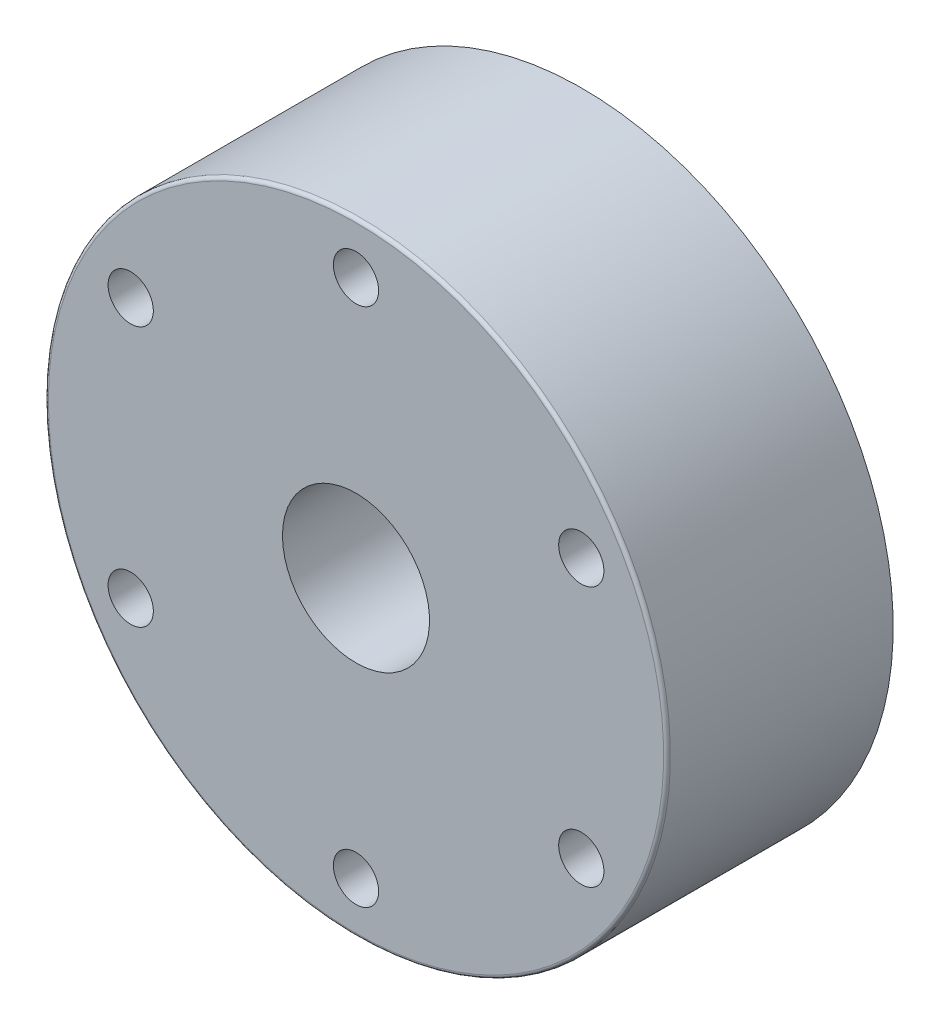
ISO-10303-21;
HEADER;
FILE_DESCRIPTION(('STEP AP214'),'2;1');
FILE_NAME('part.step','',(''),(''),'','','');
FILE_SCHEMA(('AUTOMOTIVE_DESIGN { 1 0 10303 214 1 1 1 1 }'));
ENDSEC;
DATA;
#1=APPLICATION_CONTEXT('core data for automotive mechanical design processes');
#2=APPLICATION_PROTOCOL_DEFINITION('international standard','automotive_design',2000,#1);
#3=PRODUCT_CONTEXT('',#1,'mechanical');
#4=PRODUCT('Part','Part','',(#3));
#5=PRODUCT_RELATED_PRODUCT_CATEGORY('part','',(#4));
#6=PRODUCT_DEFINITION_FORMATION('','',#4);
#7=PRODUCT_DEFINITION_CONTEXT('part definition',#1,'design');
#8=PRODUCT_DEFINITION('design','',#6,#7);
#9=PRODUCT_DEFINITION_SHAPE('','',#8);
#10=(LENGTH_UNIT() NAMED_UNIT(*) SI_UNIT(.MILLI.,.METRE.));
#11=(NAMED_UNIT(*) PLANE_ANGLE_UNIT() SI_UNIT($,.RADIAN.));
#12=(NAMED_UNIT(*) SI_UNIT($,.STERADIAN.) SOLID_ANGLE_UNIT());
#13=UNCERTAINTY_MEASURE_WITH_UNIT(LENGTH_MEASURE(1.E-05),#10,'distance_accuracy_value','');
#14=(GEOMETRIC_REPRESENTATION_CONTEXT(3) GLOBAL_UNCERTAINTY_ASSIGNED_CONTEXT((#13)) GLOBAL_UNIT_ASSIGNED_CONTEXT((#10,
#11,#12)) REPRESENTATION_CONTEXT('',''));
#15=CARTESIAN_POINT('',(0.,0.,0.));
#16=DIRECTION('',(0.,0.,1.));
#17=DIRECTION('',(1.,0.,0.));
#18=AXIS2_PLACEMENT_3D('',#15,#16,#17);
#19=CARTESIAN_POINT('',(0.,0.,0.));
#20=DIRECTION('',(0.,0.,1.));
#21=DIRECTION('',(1.,0.,0.));
#22=AXIS2_PLACEMENT_3D('',#19,#20,#21);
#23=PLANE('',#22);
#24=CARTESIAN_POINT('',(0.,0.,0.));
#25=DIRECTION('',(0.,0.,1.));
#26=DIRECTION('',(1.,0.,0.));
#27=AXIS2_PLACEMENT_3D('',#24,#25,#26);
#28=CIRCLE('',#27,6.5);
#29=CARTESIAN_POINT('',(-6.5,0.,0.));
#30=VERTEX_POINT('',#29);
#31=EDGE_CURVE('E149',#30,#30,#28,.T.);
#32=ORIENTED_EDGE('',*,*,#31,.T.);
#33=EDGE_LOOP('',(#32));
#34=FACE_BOUND('',#33,.T.);
#35=CARTESIAN_POINT('',(0.,0.,0.));
#36=DIRECTION('',(0.,0.,1.));
#37=DIRECTION('',(1.,0.,0.));
#38=AXIS2_PLACEMENT_3D('',#35,#36,#37);
#39=CIRCLE('',#38,27.5);
#40=CARTESIAN_POINT('',(-27.5,0.,0.));
#41=VERTEX_POINT('',#40);
#42=EDGE_CURVE('E20',#41,#41,#39,.T.);
#43=ORIENTED_EDGE('',*,*,#42,.F.);
#44=EDGE_LOOP('',(#43));
#45=FACE_BOUND('',#44,.T.);
#46=ADVANCED_FACE('F17',(#34,#45),#23,.F.);
#47=CARTESIAN_POINT('',(0.,23.,10.));
#48=DIRECTION('',(0.,0.,1.));
#49=DIRECTION('',(1.,0.,0.));
#50=AXIS2_PLACEMENT_3D('',#47,#48,#49);
#51=PLANE('',#50);
#52=CARTESIAN_POINT('',(0.,23.,10.));
#53=DIRECTION('',(0.,0.,-1.));
#54=DIRECTION('',(1.,0.,0.));
#55=AXIS2_PLACEMENT_3D('',#52,#53,#54);
#56=CIRCLE('',#55,2.);
#57=CARTESIAN_POINT('',(-2.,23.,10.));
#58=VERTEX_POINT('',#57);
#59=EDGE_CURVE('E11',#58,#58,#56,.T.);
#60=ORIENTED_EDGE('',*,*,#59,.F.);
#61=EDGE_LOOP('',(#60));
#62=FACE_BOUND('',#61,.T.);
#63=ADVANCED_FACE('F209',(#62),#51,.T.);
#64=CARTESIAN_POINT('',(0.,23.,20.));
#65=DIRECTION('',(0.,0.,-1.));
#66=DIRECTION('',(1.,0.,0.));
#67=AXIS2_PLACEMENT_3D('',#64,#65,#66);
#68=CYLINDRICAL_SURFACE('',#67,2.);
#69=CARTESIAN_POINT('',(0.,23.,20.));
#70=DIRECTION('',(0.,0.,-1.));
#71=DIRECTION('',(1.,0.,0.));
#72=AXIS2_PLACEMENT_3D('',#69,#70,#71);
#73=CIRCLE('',#72,2.);
#74=CARTESIAN_POINT('',(-2.,23.,20.));
#75=VERTEX_POINT('',#74);
#76=EDGE_CURVE('E120',#75,#75,#73,.T.);
#77=ORIENTED_EDGE('',*,*,#76,.F.);
#78=DIRECTION('',(0.,0.,-1.));
#79=VECTOR('',#78,1.);
#80=CARTESIAN_POINT('',(-2.,23.,20.));
#81=LINE('',#80,#79);
#82=EDGE_CURVE('E26',#75,#58,#81,.T.);
#83=ORIENTED_EDGE('',*,*,#82,.T.);
#84=ORIENTED_EDGE('',*,*,#59,.T.);
#85=ORIENTED_EDGE('',*,*,#82,.F.);
#86=EDGE_LOOP('',(#77,#83,#84,#85));
#87=FACE_BOUND('',#86,.T.);
#88=ADVANCED_FACE('F215',(#87),#68,.F.);
#89=CARTESIAN_POINT('',(-19.9185842870421,-11.5,10.));
#90=DIRECTION('',(0.,0.,1.));
#91=DIRECTION('',(1.,0.,0.));
#92=AXIS2_PLACEMENT_3D('',#89,#90,#91);
#93=PLANE('',#92);
#94=CARTESIAN_POINT('',(-19.9185842870421,-11.5,10.));
#95=DIRECTION('',(0.,0.,-1.));
#96=DIRECTION('',(1.,0.,0.));
#97=AXIS2_PLACEMENT_3D('',#94,#95,#96);
#98=CIRCLE('',#97,2.);
#99=CARTESIAN_POINT('',(-21.9185842870421,-11.5,10.));
#100=VERTEX_POINT('',#99);
#101=EDGE_CURVE('E49',#100,#100,#98,.T.);
#102=ORIENTED_EDGE('',*,*,#101,.F.);
#103=EDGE_LOOP('',(#102));
#104=FACE_BOUND('',#103,.T.);
#105=ADVANCED_FACE('F278',(#104),#93,.T.);
#106=CARTESIAN_POINT('',(-19.9185842870421,-11.5,20.));
#107=DIRECTION('',(0.,0.,-1.));
#108=DIRECTION('',(1.,0.,0.));
#109=AXIS2_PLACEMENT_3D('',#106,#107,#108);
#110=CYLINDRICAL_SURFACE('',#109,2.);
#111=CARTESIAN_POINT('',(-19.9185842870421,-11.5,20.));
#112=DIRECTION('',(0.,0.,-1.));
#113=DIRECTION('',(1.,0.,0.));
#114=AXIS2_PLACEMENT_3D('',#111,#112,#113);
#115=CIRCLE('',#114,2.);
#116=CARTESIAN_POINT('',(-21.9185842870421,-11.5,20.));
#117=VERTEX_POINT('',#116);
#118=EDGE_CURVE('E130',#117,#117,#115,.T.);
#119=ORIENTED_EDGE('',*,*,#118,.F.);
#120=DIRECTION('',(0.,0.,-1.));
#121=VECTOR('',#120,1.);
#122=CARTESIAN_POINT('',(-21.9185842870421,-11.5,20.));
#123=LINE('',#122,#121);
#124=EDGE_CURVE('E123',#117,#100,#123,.T.);
#125=ORIENTED_EDGE('',*,*,#124,.T.);
#126=ORIENTED_EDGE('',*,*,#101,.T.);
#127=ORIENTED_EDGE('',*,*,#124,.F.);
#128=EDGE_LOOP('',(#119,#125,#126,#127));
#129=FACE_BOUND('',#128,.T.);
#130=ADVANCED_FACE('F235',(#129),#110,.F.);
#131=CARTESIAN_POINT('',(0.,-23.,10.));
#132=DIRECTION('',(0.,0.,1.));
#133=DIRECTION('',(1.,0.,0.));
#134=AXIS2_PLACEMENT_3D('',#131,#132,#133);
#135=PLANE('',#134);
#136=CARTESIAN_POINT('',(0.,-23.,10.));
#137=DIRECTION('',(0.,0.,-1.));
#138=DIRECTION('',(1.,0.,0.));
#139=AXIS2_PLACEMENT_3D('',#136,#137,#138);
#140=CIRCLE('',#139,2.);
#141=CARTESIAN_POINT('',(-2.,-23.,10.));
#142=VERTEX_POINT('',#141);
#143=EDGE_CURVE('E141',#142,#142,#140,.T.);
#144=ORIENTED_EDGE('',*,*,#143,.F.);
#145=EDGE_LOOP('',(#144));
#146=FACE_BOUND('',#145,.T.);
#147=ADVANCED_FACE('F346',(#146),#135,.T.);
#148=CARTESIAN_POINT('',(0.,-23.,20.));
#149=DIRECTION('',(0.,0.,-1.));
#150=DIRECTION('',(1.,0.,0.));
#151=AXIS2_PLACEMENT_3D('',#148,#149,#150);
#152=CYLINDRICAL_SURFACE('',#151,2.);
#153=CARTESIAN_POINT('',(0.,-23.,20.));
#154=DIRECTION('',(0.,0.,-1.));
#155=DIRECTION('',(1.,0.,0.));
#156=AXIS2_PLACEMENT_3D('',#153,#154,#155);
#157=CIRCLE('',#156,2.);
#158=CARTESIAN_POINT('',(-2.,-23.,20.));
#159=VERTEX_POINT('',#158);
#160=EDGE_CURVE('E125',#159,#159,#157,.T.);
#161=ORIENTED_EDGE('',*,*,#160,.F.);
#162=DIRECTION('',(0.,0.,-1.));
#163=VECTOR('',#162,1.);
#164=CARTESIAN_POINT('',(-2.,-23.,20.));
#165=LINE('',#164,#163);
#166=EDGE_CURVE('E137',#159,#142,#165,.T.);
#167=ORIENTED_EDGE('',*,*,#166,.T.);
#168=ORIENTED_EDGE('',*,*,#143,.T.);
#169=ORIENTED_EDGE('',*,*,#166,.F.);
#170=EDGE_LOOP('',(#161,#167,#168,#169));
#171=FACE_BOUND('',#170,.T.);
#172=ADVANCED_FACE('F290',(#171),#152,.F.);
#173=CARTESIAN_POINT('',(19.9185842870421,11.5,10.));
#174=DIRECTION('',(0.,0.,1.));
#175=DIRECTION('',(1.,0.,0.));
#176=AXIS2_PLACEMENT_3D('',#173,#174,#175);
#177=PLANE('',#176);
#178=CARTESIAN_POINT('',(19.9185842870421,11.5,10.));
#179=DIRECTION('',(0.,0.,-1.));
#180=DIRECTION('',(1.,0.,0.));
#181=AXIS2_PLACEMENT_3D('',#178,#179,#180);
#182=CIRCLE('',#181,2.);
#183=CARTESIAN_POINT('',(17.9185842870421,11.5,10.));
#184=VERTEX_POINT('',#183);
#185=EDGE_CURVE('E135',#184,#184,#182,.T.);
#186=ORIENTED_EDGE('',*,*,#185,.F.);
#187=EDGE_LOOP('',(#186));
#188=FACE_BOUND('',#187,.T.);
#189=ADVANCED_FACE('F284',(#188),#177,.T.);
#190=CARTESIAN_POINT('',(19.9185842870421,11.5,20.));
#191=DIRECTION('',(0.,0.,-1.));
#192=DIRECTION('',(1.,0.,0.));
#193=AXIS2_PLACEMENT_3D('',#190,#191,#192);
#194=CYLINDRICAL_SURFACE('',#193,2.);
#195=CARTESIAN_POINT('',(19.9185842870421,11.5,20.));
#196=DIRECTION('',(0.,0.,-1.));
#197=DIRECTION('',(1.,0.,0.));
#198=AXIS2_PLACEMENT_3D('',#195,#196,#197);
#199=CIRCLE('',#198,2.);
#200=CARTESIAN_POINT('',(17.9185842870421,11.5,20.));
#201=VERTEX_POINT('',#200);
#202=EDGE_CURVE('E129',#201,#201,#199,.T.);
#203=ORIENTED_EDGE('',*,*,#202,.F.);
#204=DIRECTION('',(0.,0.,-1.));
#205=VECTOR('',#204,1.);
#206=CARTESIAN_POINT('',(17.9185842870421,11.5,20.));
#207=LINE('',#206,#205);
#208=EDGE_CURVE('E131',#201,#184,#207,.T.);
#209=ORIENTED_EDGE('',*,*,#208,.T.);
#210=ORIENTED_EDGE('',*,*,#185,.T.);
#211=ORIENTED_EDGE('',*,*,#208,.F.);
#212=EDGE_LOOP('',(#203,#209,#210,#211));
#213=FACE_BOUND('',#212,.T.);
#214=ADVANCED_FACE('F289',(#213),#194,.F.);
#215=CARTESIAN_POINT('',(-19.9185842870421,11.5,10.));
#216=DIRECTION('',(0.,0.,1.));
#217=DIRECTION('',(1.,0.,0.));
#218=AXIS2_PLACEMENT_3D('',#215,#216,#217);
#219=PLANE('',#218);
#220=CARTESIAN_POINT('',(-19.9185842870421,11.5,10.));
#221=DIRECTION('',(0.,0.,-1.));
#222=DIRECTION('',(1.,0.,0.));
#223=AXIS2_PLACEMENT_3D('',#220,#221,#222);
#224=CIRCLE('',#223,2.);
#225=CARTESIAN_POINT('',(-21.9185842870421,11.5,10.));
#226=VERTEX_POINT('',#225);
#227=EDGE_CURVE('E136',#226,#226,#224,.T.);
#228=ORIENTED_EDGE('',*,*,#227,.F.);
#229=EDGE_LOOP('',(#228));
#230=FACE_BOUND('',#229,.T.);
#231=ADVANCED_FACE('F203',(#230),#219,.T.);
#232=CARTESIAN_POINT('',(-19.9185842870421,11.5,20.));
#233=DIRECTION('',(0.,0.,-1.));
#234=DIRECTION('',(1.,0.,0.));
#235=AXIS2_PLACEMENT_3D('',#232,#233,#234);
#236=CYLINDRICAL_SURFACE('',#235,2.);
#237=CARTESIAN_POINT('',(-19.9185842870421,11.5,20.));
#238=DIRECTION('',(0.,0.,-1.));
#239=DIRECTION('',(1.,0.,0.));
#240=AXIS2_PLACEMENT_3D('',#237,#238,#239);
#241=CIRCLE('',#240,2.);
#242=CARTESIAN_POINT('',(-21.9185842870421,11.5,20.));
#243=VERTEX_POINT('',#242);
#244=EDGE_CURVE('E155',#243,#243,#241,.T.);
#245=ORIENTED_EDGE('',*,*,#244,.F.);
#246=DIRECTION('',(0.,0.,-1.));
#247=VECTOR('',#246,1.);
#248=CARTESIAN_POINT('',(-21.9185842870421,11.5,20.));
#249=LINE('',#248,#247);
#250=EDGE_CURVE('E144',#243,#226,#249,.T.);
#251=ORIENTED_EDGE('',*,*,#250,.T.);
#252=ORIENTED_EDGE('',*,*,#227,.T.);
#253=ORIENTED_EDGE('',*,*,#250,.F.);
#254=EDGE_LOOP('',(#245,#251,#252,#253));
#255=FACE_BOUND('',#254,.T.);
#256=ADVANCED_FACE('F193',(#255),#236,.F.);
#257=CARTESIAN_POINT('',(19.9185842870421,-11.5,10.));
#258=DIRECTION('',(0.,0.,1.));
#259=DIRECTION('',(1.,0.,0.));
#260=AXIS2_PLACEMENT_3D('',#257,#258,#259);
#261=PLANE('',#260);
#262=CARTESIAN_POINT('',(19.9185842870421,-11.5,10.));
#263=DIRECTION('',(0.,0.,-1.));
#264=DIRECTION('',(1.,0.,0.));
#265=AXIS2_PLACEMENT_3D('',#262,#263,#264);
#266=CIRCLE('',#265,2.);
#267=CARTESIAN_POINT('',(17.9185842870421,-11.5,10.));
#268=VERTEX_POINT('',#267);
#269=EDGE_CURVE('E148',#268,#268,#266,.T.);
#270=ORIENTED_EDGE('',*,*,#269,.F.);
#271=EDGE_LOOP('',(#270));
#272=FACE_BOUND('',#271,.T.);
#273=ADVANCED_FACE('F191',(#272),#261,.T.);
#274=CARTESIAN_POINT('',(19.9185842870421,-11.5,20.));
#275=DIRECTION('',(0.,0.,-1.));
#276=DIRECTION('',(1.,0.,0.));
#277=AXIS2_PLACEMENT_3D('',#274,#275,#276);
#278=CYLINDRICAL_SURFACE('',#277,2.);
#279=CARTESIAN_POINT('',(19.9185842870421,-11.5,20.));
#280=DIRECTION('',(0.,0.,-1.));
#281=DIRECTION('',(1.,0.,0.));
#282=AXIS2_PLACEMENT_3D('',#279,#280,#281);
#283=CIRCLE('',#282,2.);
#284=CARTESIAN_POINT('',(17.9185842870421,-11.5,20.));
#285=VERTEX_POINT('',#284);
#286=EDGE_CURVE('E159',#285,#285,#283,.T.);
#287=ORIENTED_EDGE('',*,*,#286,.F.);
#288=DIRECTION('',(0.,0.,-1.));
#289=VECTOR('',#288,1.);
#290=CARTESIAN_POINT('',(17.9185842870421,-11.5,20.));
#291=LINE('',#290,#289);
#292=EDGE_CURVE('E153',#285,#268,#291,.T.);
#293=ORIENTED_EDGE('',*,*,#292,.T.);
#294=ORIENTED_EDGE('',*,*,#269,.T.);
#295=ORIENTED_EDGE('',*,*,#292,.F.);
#296=EDGE_LOOP('',(#287,#293,#294,#295));
#297=FACE_BOUND('',#296,.T.);
#298=ADVANCED_FACE('F189',(#297),#278,.F.);
#299=CARTESIAN_POINT('',(0.,0.,20.));
#300=DIRECTION('',(0.,0.,-1.));
#301=DIRECTION('',(1.,0.,0.));
#302=AXIS2_PLACEMENT_3D('',#299,#300,#301);
#303=CYLINDRICAL_SURFACE('',#302,6.5);
#304=CARTESIAN_POINT('',(0.,0.,20.));
#305=DIRECTION('',(0.,0.,-1.));
#306=DIRECTION('',(1.,0.,0.));
#307=AXIS2_PLACEMENT_3D('',#304,#305,#306);
#308=CIRCLE('',#307,6.5);
#309=CARTESIAN_POINT('',(-6.5,0.,20.));
#310=VERTEX_POINT('',#309);
#311=EDGE_CURVE('E163',#310,#310,#308,.T.);
#312=ORIENTED_EDGE('',*,*,#311,.F.);
#313=DIRECTION('',(0.,0.,-1.));
#314=VECTOR('',#313,1.);
#315=CARTESIAN_POINT('',(-6.5,0.,20.));
#316=LINE('',#315,#314);
#317=EDGE_CURVE('E154',#310,#30,#316,.T.);
#318=ORIENTED_EDGE('',*,*,#317,.T.);
#319=ORIENTED_EDGE('',*,*,#31,.F.);
#320=ORIENTED_EDGE('',*,*,#317,.F.);
#321=EDGE_LOOP('',(#312,#318,#319,#320));
#322=FACE_BOUND('',#321,.T.);
#323=ADVANCED_FACE('F201',(#322),#303,.F.);
#324=CARTESIAN_POINT('',(0.,0.,20.));
#325=DIRECTION('',(0.,0.,1.));
#326=DIRECTION('',(1.,0.,0.));
#327=AXIS2_PLACEMENT_3D('',#324,#325,#326);
#328=PLANE('',#327);
#329=ORIENTED_EDGE('',*,*,#311,.T.);
#330=EDGE_LOOP('',(#329));
#331=FACE_BOUND('',#330,.T.);
#332=ORIENTED_EDGE('',*,*,#286,.T.);
#333=EDGE_LOOP('',(#332));
#334=FACE_BOUND('',#333,.T.);
#335=ORIENTED_EDGE('',*,*,#244,.T.);
#336=EDGE_LOOP('',(#335));
#337=FACE_BOUND('',#336,.T.);
#338=ORIENTED_EDGE('',*,*,#202,.T.);
#339=EDGE_LOOP('',(#338));
#340=FACE_BOUND('',#339,.T.);
#341=ORIENTED_EDGE('',*,*,#160,.T.);
#342=EDGE_LOOP('',(#341));
#343=FACE_BOUND('',#342,.T.);
#344=ORIENTED_EDGE('',*,*,#118,.T.);
#345=EDGE_LOOP('',(#344));
#346=FACE_BOUND('',#345,.T.);
#347=ORIENTED_EDGE('',*,*,#76,.T.);
#348=EDGE_LOOP('',(#347));
#349=FACE_BOUND('',#348,.T.);
#350=CARTESIAN_POINT('',(0.,0.,20.));
#351=DIRECTION('',(0.,0.,-1.));
#352=DIRECTION('',(-1.,0.,0.));
#353=AXIS2_PLACEMENT_3D('',#350,#351,#352);
#354=CIRCLE('',#353,27.2);
#355=CARTESIAN_POINT('',(-27.2,0.,20.));
#356=VERTEX_POINT('',#355);
#357=EDGE_CURVE('E105',#356,#356,#354,.T.);
#358=ORIENTED_EDGE('',*,*,#357,.F.);
#359=EDGE_LOOP('',(#358));
#360=FACE_BOUND('',#359,.T.);
#361=ADVANCED_FACE('F237',(#331,#334,#337,#340,#343,#346,#349,#360),#328,.T.);
#362=CARTESIAN_POINT('',(0.,0.,0.));
#363=DIRECTION('',(0.,0.,1.));
#364=DIRECTION('',(1.,0.,0.));
#365=AXIS2_PLACEMENT_3D('',#362,#363,#364);
#366=CYLINDRICAL_SURFACE('',#365,27.5);
#367=CARTESIAN_POINT('',(0.,0.,19.7));
#368=DIRECTION('',(0.,0.,1.));
#369=DIRECTION('',(-1.,0.,0.));
#370=AXIS2_PLACEMENT_3D('',#367,#368,#369);
#371=CIRCLE('',#370,27.5);
#372=CARTESIAN_POINT('',(-27.5,0.,19.7));
#373=VERTEX_POINT('',#372);
#374=EDGE_CURVE('E107',#373,#373,#371,.T.);
#375=ORIENTED_EDGE('',*,*,#374,.F.);
#376=DIRECTION('',(0.,0.,-1.));
#377=VECTOR('',#376,1.);
#378=CARTESIAN_POINT('',(-27.5,0.,0.));
#379=LINE('',#378,#377);
#380=EDGE_CURVE('E115',#373,#41,#379,.T.);
#381=ORIENTED_EDGE('',*,*,#380,.T.);
#382=ORIENTED_EDGE('',*,*,#42,.T.);
#383=ORIENTED_EDGE('',*,*,#380,.F.);
#384=EDGE_LOOP('',(#375,#381,#382,#383));
#385=FACE_BOUND('',#384,.T.);
#386=ADVANCED_FACE('F224',(#385),#366,.T.);
#387=CARTESIAN_POINT('',(0.,0.,19.7));
#388=DIRECTION('',(0.,0.,1.));
#389=DIRECTION('',(1.,0.,0.));
#390=AXIS2_PLACEMENT_3D('',#387,#388,#389);
#391=TOROIDAL_SURFACE('',#390,27.2,0.3);
#392=ORIENTED_EDGE('',*,*,#357,.T.);
#393=CARTESIAN_POINT('',(-27.2,0.,19.7));
#394=DIRECTION('',(0.,-1.,0.));
#395=DIRECTION('',(-1.,0.,0.));
#396=AXIS2_PLACEMENT_3D('',#393,#394,#395);
#397=CIRCLE('',#396,0.3);
#398=EDGE_CURVE('E102',#356,#373,#397,.T.);
#399=ORIENTED_EDGE('',*,*,#398,.T.);
#400=ORIENTED_EDGE('',*,*,#374,.T.);
#401=ORIENTED_EDGE('',*,*,#398,.F.);
#402=EDGE_LOOP('',(#392,#399,#400,#401));
#403=FACE_BOUND('',#402,.T.);
#404=ADVANCED_FACE('F103',(#403),#391,.T.);
#405=CLOSED_SHELL('',(#46,#63,#88,#105,#130,#147,#172,#189,#214,#231,#256,#273,#298,#323,#361,
#386,#404));
#406=MANIFOLD_SOLID_BREP('B1',#405);
#407=ADVANCED_BREP_SHAPE_REPRESENTATION('',(#18,#406),#14);
#408=SHAPE_DEFINITION_REPRESENTATION(#9,#407);
ENDSEC;
END-ISO-10303-21;
